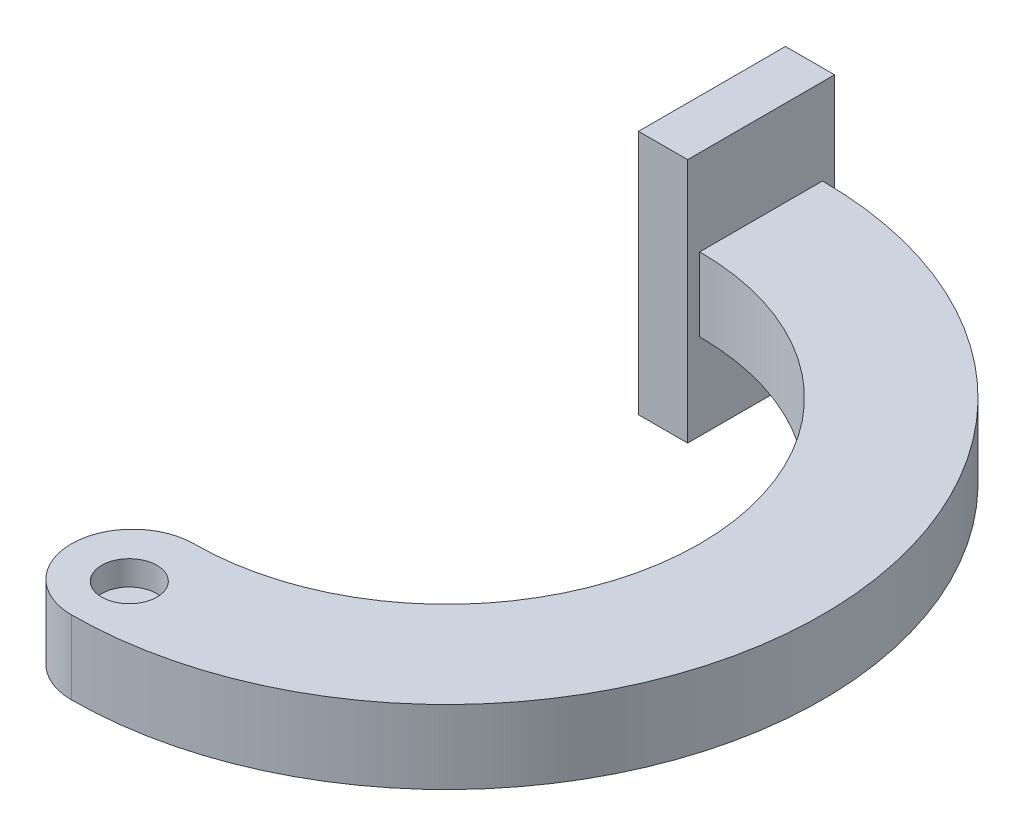
ISO-10303-21;
HEADER;
FILE_DESCRIPTION(('STEP AP214'),'2;1');
FILE_NAME('part.step','',(''),(''),'','','');
FILE_SCHEMA(('AUTOMOTIVE_DESIGN { 1 0 10303 214 1 1 1 1 }'));
ENDSEC;
DATA;
#1=APPLICATION_CONTEXT('core data for automotive mechanical design processes');
#2=APPLICATION_PROTOCOL_DEFINITION('international standard','automotive_design',2000,#1);
#3=PRODUCT_CONTEXT('',#1,'mechanical');
#4=PRODUCT('Part','Part','',(#3));
#5=PRODUCT_RELATED_PRODUCT_CATEGORY('part','',(#4));
#6=PRODUCT_DEFINITION_FORMATION('','',#4);
#7=PRODUCT_DEFINITION_CONTEXT('part definition',#1,'design');
#8=PRODUCT_DEFINITION('design','',#6,#7);
#9=PRODUCT_DEFINITION_SHAPE('','',#8);
#10=(LENGTH_UNIT() NAMED_UNIT(*) SI_UNIT(.MILLI.,.METRE.));
#11=(NAMED_UNIT(*) PLANE_ANGLE_UNIT() SI_UNIT($,.RADIAN.));
#12=(NAMED_UNIT(*) SI_UNIT($,.STERADIAN.) SOLID_ANGLE_UNIT());
#13=UNCERTAINTY_MEASURE_WITH_UNIT(LENGTH_MEASURE(1.E-05),#10,'distance_accuracy_value','');
#14=(GEOMETRIC_REPRESENTATION_CONTEXT(3) GLOBAL_UNCERTAINTY_ASSIGNED_CONTEXT((#13)) GLOBAL_UNIT_ASSIGNED_CONTEXT((#10,
#11,#12)) REPRESENTATION_CONTEXT('',''));
#15=CARTESIAN_POINT('',(0.,0.,0.));
#16=DIRECTION('',(0.,0.,1.));
#17=DIRECTION('',(1.,0.,0.));
#18=AXIS2_PLACEMENT_3D('',#15,#16,#17);
#19=CARTESIAN_POINT('',(1.54520372794232E-13,3.,-5.));
#20=DIRECTION('',(0.,-1.,0.));
#21=DIRECTION('',(0.,0.,-1.));
#22=AXIS2_PLACEMENT_3D('',#19,#20,#21);
#23=CYLINDRICAL_SURFACE('',#22,5.);
#24=CARTESIAN_POINT('',(1.54520372794232E-13,-3.,-5.));
#25=DIRECTION('',(0.,1.,0.));
#26=DIRECTION('',(0.,0.,1.));
#27=AXIS2_PLACEMENT_3D('',#24,#25,#26);
#28=CIRCLE('',#27,5.);
#29=CARTESIAN_POINT('',(-1.55236568106899E-07,-3.,-10.));
#30=VERTEX_POINT('',#29);
#31=CARTESIAN_POINT('',(0.,-3.,0.));
#32=VERTEX_POINT('',#31);
#33=EDGE_CURVE('E151',#30,#32,#28,.T.);
#34=ORIENTED_EDGE('',*,*,#33,.T.);
#35=DIRECTION('',(0.,-1.,0.));
#36=VECTOR('',#35,1.);
#37=CARTESIAN_POINT('',(0.,3.,0.));
#38=LINE('',#37,#36);
#39=CARTESIAN_POINT('',(0.,3.,0.));
#40=VERTEX_POINT('',#39);
#41=EDGE_CURVE('E11',#40,#32,#38,.T.);
#42=ORIENTED_EDGE('',*,*,#41,.F.);
#43=CARTESIAN_POINT('',(1.54520372794232E-13,3.,-5.));
#44=DIRECTION('',(0.,1.,0.));
#45=DIRECTION('',(0.,0.,1.));
#46=AXIS2_PLACEMENT_3D('',#43,#44,#45);
#47=CIRCLE('',#46,5.);
#48=CARTESIAN_POINT('',(-1.55236568106899E-07,3.,-10.));
#49=VERTEX_POINT('',#48);
#50=EDGE_CURVE('E153',#49,#40,#47,.T.);
#51=ORIENTED_EDGE('',*,*,#50,.F.);
#52=DIRECTION('',(0.,-1.,0.));
#53=VECTOR('',#52,1.);
#54=CARTESIAN_POINT('',(-1.55236568106899E-07,3.,-10.));
#55=LINE('',#54,#53);
#56=EDGE_CURVE('E163',#49,#30,#55,.T.);
#57=ORIENTED_EDGE('',*,*,#56,.T.);
#58=EDGE_LOOP('',(#34,#42,#51,#57));
#59=FACE_BOUND('',#58,.T.);
#60=ADVANCED_FACE('F39',(#59),#23,.T.);
#61=CARTESIAN_POINT('',(0.,3.,-30.6));
#62=DIRECTION('',(0.,-1.,0.));
#63=DIRECTION('',(0.,0.,-1.));
#64=AXIS2_PLACEMENT_3D('',#61,#62,#63);
#65=CYLINDRICAL_SURFACE('',#64,30.6);
#66=CARTESIAN_POINT('',(0.,-3.,-30.6));
#67=DIRECTION('',(0.,1.,0.));
#68=DIRECTION('',(0.,0.,1.));
#69=AXIS2_PLACEMENT_3D('',#66,#67,#68);
#70=CIRCLE('',#69,30.6);
#71=CARTESIAN_POINT('',(0.,-3.,-61.2));
#72=VERTEX_POINT('',#71);
#73=EDGE_CURVE('E69',#32,#72,#70,.T.);
#74=ORIENTED_EDGE('',*,*,#73,.T.);
#75=DIRECTION('',(0.,-1.,0.));
#76=VECTOR('',#75,1.);
#77=CARTESIAN_POINT('',(0.,3.,-61.2));
#78=LINE('',#77,#76);
#79=CARTESIAN_POINT('',(0.,3.,-61.2));
#80=VERTEX_POINT('',#79);
#81=EDGE_CURVE('E48',#80,#72,#78,.T.);
#82=ORIENTED_EDGE('',*,*,#81,.F.);
#83=CARTESIAN_POINT('',(0.,3.,-30.6));
#84=DIRECTION('',(0.,1.,0.));
#85=DIRECTION('',(0.,0.,1.));
#86=AXIS2_PLACEMENT_3D('',#83,#84,#85);
#87=CIRCLE('',#86,30.6);
#88=EDGE_CURVE('E81',#40,#80,#87,.T.);
#89=ORIENTED_EDGE('',*,*,#88,.F.);
#90=ORIENTED_EDGE('',*,*,#41,.T.);
#91=EDGE_LOOP('',(#74,#82,#89,#90));
#92=FACE_BOUND('',#91,.T.);
#93=ADVANCED_FACE('F186',(#92),#65,.T.);
#94=CARTESIAN_POINT('',(-7.94811228707326E-07,3.,-30.6));
#95=DIRECTION('',(0.,-1.,0.));
#96=DIRECTION('',(0.,0.,-1.));
#97=AXIS2_PLACEMENT_3D('',#94,#95,#96);
#98=CYLINDRICAL_SURFACE('',#97,20.6);
#99=CARTESIAN_POINT('',(-7.94811228707326E-07,-3.,-30.6));
#100=DIRECTION('',(0.,-1.,0.));
#101=DIRECTION('',(0.,0.,1.));
#102=AXIS2_PLACEMENT_3D('',#99,#100,#101);
#103=CIRCLE('',#102,20.6);
#104=CARTESIAN_POINT('',(1.70423621596983E-12,-3.,-51.2));
#105=VERTEX_POINT('',#104);
#106=EDGE_CURVE('E76',#105,#30,#103,.T.);
#107=ORIENTED_EDGE('',*,*,#106,.T.);
#108=ORIENTED_EDGE('',*,*,#56,.F.);
#109=CARTESIAN_POINT('',(-7.94811228707326E-07,3.,-30.6));
#110=DIRECTION('',(0.,-1.,0.));
#111=DIRECTION('',(0.,0.,1.));
#112=AXIS2_PLACEMENT_3D('',#109,#110,#111);
#113=CIRCLE('',#112,20.6);
#114=CARTESIAN_POINT('',(-3.3543632967888E-13,3.,-51.2));
#115=VERTEX_POINT('',#114);
#116=EDGE_CURVE('E56',#115,#49,#113,.T.);
#117=ORIENTED_EDGE('',*,*,#116,.F.);
#118=DIRECTION('',(0.,-1.,0.));
#119=VECTOR('',#118,1.);
#120=CARTESIAN_POINT('',(-3.3543632967888E-13,3.,-51.2));
#121=LINE('',#120,#119);
#122=EDGE_CURVE('E177',#115,#105,#121,.T.);
#123=ORIENTED_EDGE('',*,*,#122,.T.);
#124=EDGE_LOOP('',(#107,#108,#117,#123));
#125=FACE_BOUND('',#124,.T.);
#126=ADVANCED_FACE('F188',(#125),#98,.F.);
#127=CARTESIAN_POINT('',(1.54520372794232E-13,3.,-5.));
#128=DIRECTION('',(0.,1.,0.));
#129=DIRECTION('',(0.,0.,1.));
#130=AXIS2_PLACEMENT_3D('',#127,#128,#129);
#131=PLANE('',#130);
#132=CARTESIAN_POINT('',(0.,3.,-4.72751670605298));
#133=DIRECTION('',(0.,1.,0.));
#134=DIRECTION('',(0.,0.,1.));
#135=AXIS2_PLACEMENT_3D('',#132,#133,#134);
#136=CIRCLE('',#135,2.25);
#137=CARTESIAN_POINT('',(0.,3.,-2.47751670605298));
#138=VERTEX_POINT('',#137);
#139=EDGE_CURVE('E138',#138,#138,#136,.T.);
#140=ORIENTED_EDGE('',*,*,#139,.F.);
#141=EDGE_LOOP('',(#140));
#142=FACE_BOUND('',#141,.T.);
#143=ORIENTED_EDGE('',*,*,#50,.T.);
#144=ORIENTED_EDGE('',*,*,#88,.T.);
#145=DIRECTION('',(0.,0.,1.));
#146=VECTOR('',#145,1.);
#147=CARTESIAN_POINT('',(0.,3.,-61.2));
#148=LINE('',#147,#146);
#149=EDGE_CURVE('E158',#80,#115,#148,.T.);
#150=ORIENTED_EDGE('',*,*,#149,.T.);
#151=ORIENTED_EDGE('',*,*,#116,.T.);
#152=EDGE_LOOP('',(#143,#144,#150,#151));
#153=FACE_BOUND('',#152,.T.);
#154=ADVANCED_FACE('F193',(#142,#153),#131,.T.);
#155=CARTESIAN_POINT('',(1.54520372794232E-13,-3.,-5.));
#156=DIRECTION('',(0.,1.,0.));
#157=DIRECTION('',(0.,0.,1.));
#158=AXIS2_PLACEMENT_3D('',#155,#156,#157);
#159=PLANE('',#158);
#160=ORIENTED_EDGE('',*,*,#33,.F.);
#161=ORIENTED_EDGE('',*,*,#106,.F.);
#162=DIRECTION('',(0.,0.,1.));
#163=VECTOR('',#162,1.);
#164=CARTESIAN_POINT('',(0.,-3.,-61.2));
#165=LINE('',#164,#163);
#166=EDGE_CURVE('E169',#72,#105,#165,.T.);
#167=ORIENTED_EDGE('',*,*,#166,.F.);
#168=ORIENTED_EDGE('',*,*,#73,.F.);
#169=EDGE_LOOP('',(#160,#161,#167,#168));
#170=FACE_BOUND('',#169,.T.);
#171=ADVANCED_FACE('F197',(#170),#159,.F.);
#172=CARTESIAN_POINT('',(0.,1.,-4.72751670605298));
#173=DIRECTION('',(0.,1.,0.));
#174=DIRECTION('',(0.,0.,1.));
#175=AXIS2_PLACEMENT_3D('',#172,#173,#174);
#176=CYLINDRICAL_SURFACE('',#175,2.25);
#177=CARTESIAN_POINT('',(0.,1.,-4.72751670605298));
#178=DIRECTION('',(0.,1.,0.));
#179=DIRECTION('',(0.,0.,1.));
#180=AXIS2_PLACEMENT_3D('',#177,#178,#179);
#181=CIRCLE('',#180,2.25);
#182=CARTESIAN_POINT('',(0.,1.,-2.47751670605298));
#183=VERTEX_POINT('',#182);
#184=EDGE_CURVE('E143',#183,#183,#181,.T.);
#185=ORIENTED_EDGE('',*,*,#184,.F.);
#186=EDGE_LOOP('',(#185));
#187=FACE_BOUND('',#186,.T.);
#188=ORIENTED_EDGE('',*,*,#139,.T.);
#189=EDGE_LOOP('',(#188));
#190=FACE_BOUND('',#189,.T.);
#191=ADVANCED_FACE('F200',(#187,#190),#176,.F.);
#192=CARTESIAN_POINT('',(0.,1.,-4.72751670605298));
#193=DIRECTION('',(0.,1.,0.));
#194=DIRECTION('',(0.,0.,1.));
#195=AXIS2_PLACEMENT_3D('',#192,#193,#194);
#196=PLANE('',#195);
#197=ORIENTED_EDGE('',*,*,#184,.T.);
#198=EDGE_LOOP('',(#197));
#199=FACE_BOUND('',#198,.T.);
#200=ADVANCED_FACE('F207',(#199),#196,.T.);
#201=CARTESIAN_POINT('',(-3.99999999999832,-10.,-50.2139410701821));
#202=DIRECTION('',(0.,0.,-1.));
#203=DIRECTION('',(-1.,0.,0.));
#204=AXIS2_PLACEMENT_3D('',#201,#202,#203);
#205=PLANE('',#204);
#206=DIRECTION('',(0.,1.,0.));
#207=VECTOR('',#206,1.);
#208=CARTESIAN_POINT('',(1.68435800912934E-12,-10.,-50.213941070182));
#209=LINE('',#208,#207);
#210=CARTESIAN_POINT('',(1.68435800912934E-12,-10.,-50.213941070182));
#211=VERTEX_POINT('',#210);
#212=CARTESIAN_POINT('',(1.68435800912934E-12,10.,-50.213941070182));
#213=VERTEX_POINT('',#212);
#214=EDGE_CURVE('E136',#211,#213,#209,.T.);
#215=ORIENTED_EDGE('',*,*,#214,.T.);
#216=DIRECTION('',(1.,0.,0.));
#217=VECTOR('',#216,1.);
#218=CARTESIAN_POINT('',(-3.99999999999832,10.,-50.2139410701821));
#219=LINE('',#218,#217);
#220=CARTESIAN_POINT('',(-3.99999999999832,10.,-50.2139410701821));
#221=VERTEX_POINT('',#220);
#222=EDGE_CURVE('E114',#221,#213,#219,.T.);
#223=ORIENTED_EDGE('',*,*,#222,.F.);
#224=DIRECTION('',(0.,1.,0.));
#225=VECTOR('',#224,1.);
#226=CARTESIAN_POINT('',(-3.99999999999832,-10.,-50.2139410701821));
#227=LINE('',#226,#225);
#228=CARTESIAN_POINT('',(-3.99999999999832,-10.,-50.2139410701821));
#229=VERTEX_POINT('',#228);
#230=EDGE_CURVE('E122',#229,#221,#227,.T.);
#231=ORIENTED_EDGE('',*,*,#230,.F.);
#232=DIRECTION('',(1.,0.,0.));
#233=VECTOR('',#232,1.);
#234=CARTESIAN_POINT('',(-3.99999999999832,-10.,-50.2139410701821));
#235=LINE('',#234,#233);
#236=EDGE_CURVE('E305',#229,#211,#235,.T.);
#237=ORIENTED_EDGE('',*,*,#236,.T.);
#238=EDGE_LOOP('',(#215,#223,#231,#237));
#239=FACE_BOUND('',#238,.T.);
#240=ADVANCED_FACE('F134',(#239),#205,.F.);
#241=CARTESIAN_POINT('',(-3.99999999999791,10.,-62.1860589298181));
#242=DIRECTION('',(0.,-1.,0.));
#243=DIRECTION('',(0.,0.,-1.));
#244=AXIS2_PLACEMENT_3D('',#241,#242,#243);
#245=PLANE('',#244);
#246=DIRECTION('',(0.,0.,-1.));
#247=VECTOR('',#246,1.);
#248=CARTESIAN_POINT('',(2.08594633646127E-12,10.,-62.186058929818));
#249=LINE('',#248,#247);
#250=CARTESIAN_POINT('',(2.08594633646127E-12,10.,-62.186058929818));
#251=VERTEX_POINT('',#250);
#252=EDGE_CURVE('E313',#213,#251,#249,.T.);
#253=ORIENTED_EDGE('',*,*,#252,.T.);
#254=DIRECTION('',(1.,0.,0.));
#255=VECTOR('',#254,1.);
#256=CARTESIAN_POINT('',(-3.99999999999791,10.,-62.1860589298181));
#257=LINE('',#256,#255);
#258=CARTESIAN_POINT('',(-3.99999999999791,10.,-62.1860589298181));
#259=VERTEX_POINT('',#258);
#260=EDGE_CURVE('E117',#259,#251,#257,.T.);
#261=ORIENTED_EDGE('',*,*,#260,.F.);
#262=DIRECTION('',(0.,0.,-1.));
#263=VECTOR('',#262,1.);
#264=CARTESIAN_POINT('',(-3.99999999999791,10.,-62.1860589298181));
#265=LINE('',#264,#263);
#266=EDGE_CURVE('E110',#221,#259,#265,.T.);
#267=ORIENTED_EDGE('',*,*,#266,.F.);
#268=ORIENTED_EDGE('',*,*,#222,.T.);
#269=EDGE_LOOP('',(#253,#261,#267,#268));
#270=FACE_BOUND('',#269,.T.);
#271=ADVANCED_FACE('F112',(#270),#245,.F.);
#272=CARTESIAN_POINT('',(-3.99999999999791,-10.,-62.1860589298181));
#273=DIRECTION('',(0.,0.,1.));
#274=DIRECTION('',(1.,0.,0.));
#275=AXIS2_PLACEMENT_3D('',#272,#273,#274);
#276=PLANE('',#275);
#277=DIRECTION('',(0.,-1.,0.));
#278=VECTOR('',#277,1.);
#279=CARTESIAN_POINT('',(2.08594633646127E-12,-10.,-62.186058929818));
#280=LINE('',#279,#278);
#281=CARTESIAN_POINT('',(2.08594633646127E-12,-10.,-62.186058929818));
#282=VERTEX_POINT('',#281);
#283=EDGE_CURVE('E309',#251,#282,#280,.T.);
#284=ORIENTED_EDGE('',*,*,#283,.T.);
#285=DIRECTION('',(1.,0.,0.));
#286=VECTOR('',#285,1.);
#287=CARTESIAN_POINT('',(-3.99999999999791,-10.,-62.1860589298181));
#288=LINE('',#287,#286);
#289=CARTESIAN_POINT('',(-3.99999999999791,-10.,-62.1860589298181));
#290=VERTEX_POINT('',#289);
#291=EDGE_CURVE('E145',#290,#282,#288,.T.);
#292=ORIENTED_EDGE('',*,*,#291,.F.);
#293=DIRECTION('',(0.,-1.,0.));
#294=VECTOR('',#293,1.);
#295=CARTESIAN_POINT('',(-3.99999999999791,-10.,-62.1860589298181));
#296=LINE('',#295,#294);
#297=EDGE_CURVE('E121',#259,#290,#296,.T.);
#298=ORIENTED_EDGE('',*,*,#297,.F.);
#299=ORIENTED_EDGE('',*,*,#260,.T.);
#300=EDGE_LOOP('',(#284,#292,#298,#299));
#301=FACE_BOUND('',#300,.T.);
#302=ADVANCED_FACE('F216',(#301),#276,.F.);
#303=CARTESIAN_POINT('',(-3.99999999999791,-10.,-62.1860589298181));
#304=DIRECTION('',(0.,1.,0.));
#305=DIRECTION('',(0.,0.,1.));
#306=AXIS2_PLACEMENT_3D('',#303,#304,#305);
#307=PLANE('',#306);
#308=DIRECTION('',(0.,0.,1.));
#309=VECTOR('',#308,1.);
#310=CARTESIAN_POINT('',(2.08594633646127E-12,-10.,-62.186058929818));
#311=LINE('',#310,#309);
#312=EDGE_CURVE('E132',#282,#211,#311,.T.);
#313=ORIENTED_EDGE('',*,*,#312,.T.);
#314=ORIENTED_EDGE('',*,*,#236,.F.);
#315=DIRECTION('',(0.,0.,1.));
#316=VECTOR('',#315,1.);
#317=CARTESIAN_POINT('',(-3.99999999999791,-10.,-62.1860589298181));
#318=LINE('',#317,#316);
#319=EDGE_CURVE('E127',#290,#229,#318,.T.);
#320=ORIENTED_EDGE('',*,*,#319,.F.);
#321=ORIENTED_EDGE('',*,*,#291,.T.);
#322=EDGE_LOOP('',(#313,#314,#320,#321));
#323=FACE_BOUND('',#322,.T.);
#324=ADVANCED_FACE('F219',(#323),#307,.F.);
#325=CARTESIAN_POINT('',(-4.,0.,-1.34174531871552E-13));
#326=DIRECTION('',(1.,0.,0.));
#327=DIRECTION('',(0.,0.,-1.));
#328=AXIS2_PLACEMENT_3D('',#325,#326,#327);
#329=PLANE('',#328);
#330=ORIENTED_EDGE('',*,*,#230,.T.);
#331=ORIENTED_EDGE('',*,*,#266,.T.);
#332=ORIENTED_EDGE('',*,*,#297,.T.);
#333=ORIENTED_EDGE('',*,*,#319,.T.);
#334=EDGE_LOOP('',(#330,#331,#332,#333));
#335=FACE_BOUND('',#334,.T.);
#336=ADVANCED_FACE('F125',(#335),#329,.F.);
#337=CARTESIAN_POINT('',(0.,0.,0.));
#338=DIRECTION('',(1.,0.,0.));
#339=DIRECTION('',(0.,0.,-1.));
#340=AXIS2_PLACEMENT_3D('',#337,#338,#339);
#341=PLANE('',#340);
#342=ORIENTED_EDGE('',*,*,#122,.F.);
#343=ORIENTED_EDGE('',*,*,#149,.F.);
#344=ORIENTED_EDGE('',*,*,#81,.T.);
#345=ORIENTED_EDGE('',*,*,#166,.T.);
#346=EDGE_LOOP('',(#342,#343,#344,#345));
#347=FACE_BOUND('',#346,.T.);
#348=ORIENTED_EDGE('',*,*,#214,.F.);
#349=ORIENTED_EDGE('',*,*,#312,.F.);
#350=ORIENTED_EDGE('',*,*,#283,.F.);
#351=ORIENTED_EDGE('',*,*,#252,.F.);
#352=EDGE_LOOP('',(#348,#349,#350,#351));
#353=FACE_BOUND('',#352,.T.);
#354=ADVANCED_FACE('F184',(#347,#353),#341,.T.);
#355=CLOSED_SHELL('',(#60,#93,#126,#154,#171,#191,#200,#240,#271,#302,#324,#336,#354));
#356=MANIFOLD_SOLID_BREP('B2',#355);
#357=ADVANCED_BREP_SHAPE_REPRESENTATION('',(#18,#356),#14);
#358=SHAPE_DEFINITION_REPRESENTATION(#9,#357);
ENDSEC;
END-ISO-10303-21;
